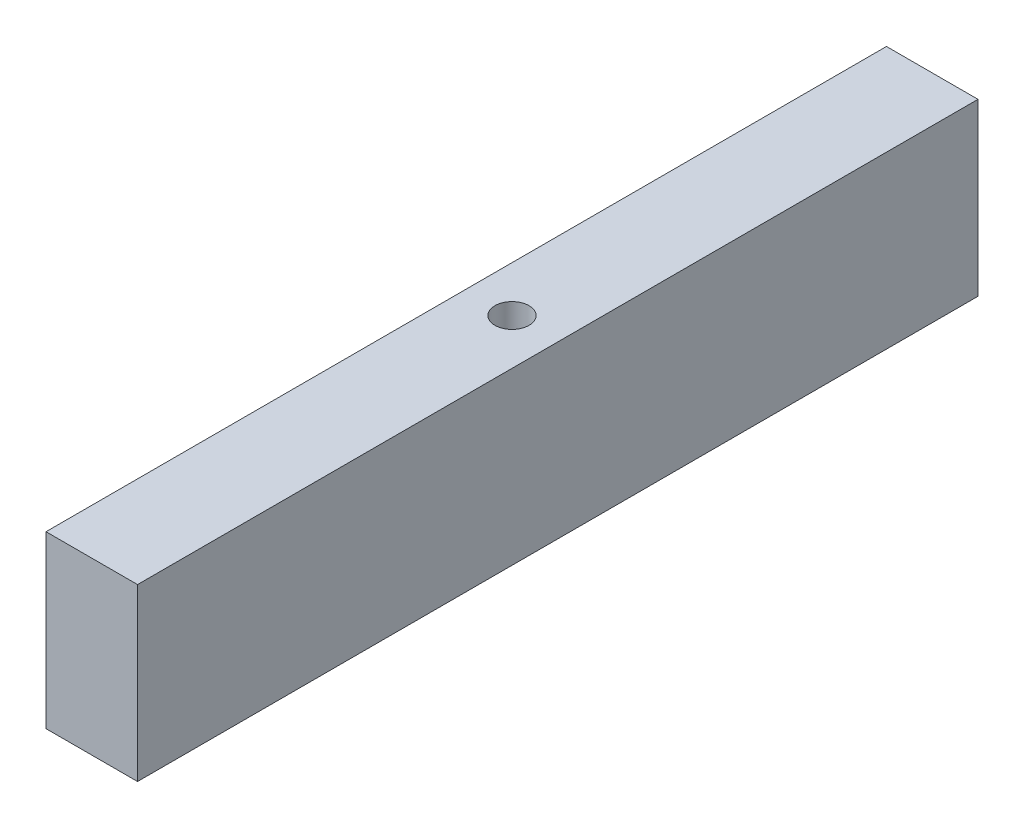
ISO-10303-21;
HEADER;
FILE_DESCRIPTION(('STEP AP214'),'2;1');
FILE_NAME('part.step','',(''),(''),'','','');
FILE_SCHEMA(('AUTOMOTIVE_DESIGN { 1 0 10303 214 1 1 1 1 }'));
ENDSEC;
DATA;
#1=APPLICATION_CONTEXT('core data for automotive mechanical design processes');
#2=APPLICATION_PROTOCOL_DEFINITION('international standard','automotive_design',2000,#1);
#3=PRODUCT_CONTEXT('',#1,'mechanical');
#4=PRODUCT('Part','Part','',(#3));
#5=PRODUCT_RELATED_PRODUCT_CATEGORY('part','',(#4));
#6=PRODUCT_DEFINITION_FORMATION('','',#4);
#7=PRODUCT_DEFINITION_CONTEXT('part definition',#1,'design');
#8=PRODUCT_DEFINITION('design','',#6,#7);
#9=PRODUCT_DEFINITION_SHAPE('','',#8);
#10=(LENGTH_UNIT() NAMED_UNIT(*) SI_UNIT(.MILLI.,.METRE.));
#11=(NAMED_UNIT(*) PLANE_ANGLE_UNIT() SI_UNIT($,.RADIAN.));
#12=(NAMED_UNIT(*) SI_UNIT($,.STERADIAN.) SOLID_ANGLE_UNIT());
#13=UNCERTAINTY_MEASURE_WITH_UNIT(LENGTH_MEASURE(1.E-05),#10,'distance_accuracy_value','');
#14=(GEOMETRIC_REPRESENTATION_CONTEXT(3) GLOBAL_UNCERTAINTY_ASSIGNED_CONTEXT((#13)) GLOBAL_UNIT_ASSIGNED_CONTEXT((#10,
#11,#12)) REPRESENTATION_CONTEXT('',''));
#15=CARTESIAN_POINT('',(0.,0.,0.));
#16=DIRECTION('',(0.,0.,1.));
#17=DIRECTION('',(1.,0.,0.));
#18=AXIS2_PLACEMENT_3D('',#15,#16,#17);
#19=CARTESIAN_POINT('',(-11.,41.,101.));
#20=DIRECTION('',(1.,0.,0.));
#21=DIRECTION('',(0.,0.,-1.));
#22=AXIS2_PLACEMENT_3D('',#19,#20,#21);
#23=PLANE('',#22);
#24=DIRECTION('',(0.,-1.,0.));
#25=VECTOR('',#24,1.);
#26=CARTESIAN_POINT('',(-11.,41.,-101.));
#27=LINE('',#26,#25);
#28=CARTESIAN_POINT('',(-11.,41.,-101.));
#29=VERTEX_POINT('',#28);
#30=CARTESIAN_POINT('',(-11.,0.,-101.));
#31=VERTEX_POINT('',#30);
#32=EDGE_CURVE('E107',#29,#31,#27,.T.);
#33=ORIENTED_EDGE('',*,*,#32,.T.);
#34=DIRECTION('',(0.,0.,-1.));
#35=VECTOR('',#34,1.);
#36=CARTESIAN_POINT('',(-11.,0.,101.));
#37=LINE('',#36,#35);
#38=CARTESIAN_POINT('',(-11.,0.,101.));
#39=VERTEX_POINT('',#38);
#40=EDGE_CURVE('E11',#39,#31,#37,.T.);
#41=ORIENTED_EDGE('',*,*,#40,.F.);
#42=DIRECTION('',(0.,-1.,0.));
#43=VECTOR('',#42,1.);
#44=CARTESIAN_POINT('',(-11.,41.,101.));
#45=LINE('',#44,#43);
#46=CARTESIAN_POINT('',(-11.,41.,101.));
#47=VERTEX_POINT('',#46);
#48=EDGE_CURVE('E92',#47,#39,#45,.T.);
#49=ORIENTED_EDGE('',*,*,#48,.F.);
#50=DIRECTION('',(0.,0.,-1.));
#51=VECTOR('',#50,1.);
#52=CARTESIAN_POINT('',(-11.,41.,101.));
#53=LINE('',#52,#51);
#54=EDGE_CURVE('E102',#47,#29,#53,.T.);
#55=ORIENTED_EDGE('',*,*,#54,.T.);
#56=EDGE_LOOP('',(#33,#41,#49,#55));
#57=FACE_BOUND('',#56,.T.);
#58=ADVANCED_FACE('F43',(#57),#23,.F.);
#59=CARTESIAN_POINT('',(-11.,0.,101.));
#60=DIRECTION('',(0.,1.,0.));
#61=DIRECTION('',(0.,0.,1.));
#62=AXIS2_PLACEMENT_3D('',#59,#60,#61);
#63=PLANE('',#62);
#64=CARTESIAN_POINT('',(0.,0.,0.));
#65=DIRECTION('',(0.,1.,0.));
#66=DIRECTION('',(0.,0.,1.));
#67=AXIS2_PLACEMENT_3D('',#64,#65,#66);
#68=CIRCLE('',#67,4.1);
#69=CARTESIAN_POINT('',(0.,0.,4.1));
#70=VERTEX_POINT('',#69);
#71=EDGE_CURVE('E112',#70,#70,#68,.T.);
#72=ORIENTED_EDGE('',*,*,#71,.T.);
#73=EDGE_LOOP('',(#72));
#74=FACE_BOUND('',#73,.T.);
#75=DIRECTION('',(1.,0.,0.));
#76=VECTOR('',#75,1.);
#77=CARTESIAN_POINT('',(-11.,0.,-101.));
#78=LINE('',#77,#76);
#79=CARTESIAN_POINT('',(11.,0.,-101.));
#80=VERTEX_POINT('',#79);
#81=EDGE_CURVE('E97',#31,#80,#78,.T.);
#82=ORIENTED_EDGE('',*,*,#81,.T.);
#83=DIRECTION('',(0.,0.,-1.));
#84=VECTOR('',#83,1.);
#85=CARTESIAN_POINT('',(11.,0.,101.));
#86=LINE('',#85,#84);
#87=CARTESIAN_POINT('',(11.,0.,101.));
#88=VERTEX_POINT('',#87);
#89=EDGE_CURVE('E55',#88,#80,#86,.T.);
#90=ORIENTED_EDGE('',*,*,#89,.F.);
#91=DIRECTION('',(1.,0.,0.));
#92=VECTOR('',#91,1.);
#93=CARTESIAN_POINT('',(-11.,0.,101.));
#94=LINE('',#93,#92);
#95=EDGE_CURVE('E89',#39,#88,#94,.T.);
#96=ORIENTED_EDGE('',*,*,#95,.F.);
#97=ORIENTED_EDGE('',*,*,#40,.T.);
#98=EDGE_LOOP('',(#82,#90,#96,#97));
#99=FACE_BOUND('',#98,.T.);
#100=ADVANCED_FACE('F98',(#74,#99),#63,.F.);
#101=CARTESIAN_POINT('',(11.,0.,101.));
#102=DIRECTION('',(-1.,0.,0.));
#103=DIRECTION('',(0.,0.,1.));
#104=AXIS2_PLACEMENT_3D('',#101,#102,#103);
#105=PLANE('',#104);
#106=DIRECTION('',(0.,1.,0.));
#107=VECTOR('',#106,1.);
#108=CARTESIAN_POINT('',(11.,0.,-101.));
#109=LINE('',#108,#107);
#110=CARTESIAN_POINT('',(11.,41.,-101.));
#111=VERTEX_POINT('',#110);
#112=EDGE_CURVE('E80',#80,#111,#109,.T.);
#113=ORIENTED_EDGE('',*,*,#112,.T.);
#114=DIRECTION('',(0.,0.,-1.));
#115=VECTOR('',#114,1.);
#116=CARTESIAN_POINT('',(11.,41.,101.));
#117=LINE('',#116,#115);
#118=CARTESIAN_POINT('',(11.,41.,101.));
#119=VERTEX_POINT('',#118);
#120=EDGE_CURVE('E99',#119,#111,#117,.T.);
#121=ORIENTED_EDGE('',*,*,#120,.F.);
#122=DIRECTION('',(0.,1.,0.));
#123=VECTOR('',#122,1.);
#124=CARTESIAN_POINT('',(11.,0.,101.));
#125=LINE('',#124,#123);
#126=EDGE_CURVE('E91',#88,#119,#125,.T.);
#127=ORIENTED_EDGE('',*,*,#126,.F.);
#128=ORIENTED_EDGE('',*,*,#89,.T.);
#129=EDGE_LOOP('',(#113,#121,#127,#128));
#130=FACE_BOUND('',#129,.T.);
#131=ADVANCED_FACE('F105',(#130),#105,.F.);
#132=CARTESIAN_POINT('',(11.,41.,101.));
#133=DIRECTION('',(0.,-1.,0.));
#134=DIRECTION('',(0.,0.,-1.));
#135=AXIS2_PLACEMENT_3D('',#132,#133,#134);
#136=PLANE('',#135);
#137=CARTESIAN_POINT('',(0.,41.,0.));
#138=DIRECTION('',(0.,-1.,0.));
#139=DIRECTION('',(0.,0.,-1.));
#140=AXIS2_PLACEMENT_3D('',#137,#138,#139);
#141=CIRCLE('',#140,4.1);
#142=CARTESIAN_POINT('',(0.,41.,-4.1));
#143=VERTEX_POINT('',#142);
#144=EDGE_CURVE('E46',#143,#143,#141,.T.);
#145=ORIENTED_EDGE('',*,*,#144,.T.);
#146=EDGE_LOOP('',(#145));
#147=FACE_BOUND('',#146,.T.);
#148=DIRECTION('',(-1.,0.,0.));
#149=VECTOR('',#148,1.);
#150=CARTESIAN_POINT('',(11.,41.,-101.));
#151=LINE('',#150,#149);
#152=EDGE_CURVE('E81',#111,#29,#151,.T.);
#153=ORIENTED_EDGE('',*,*,#152,.T.);
#154=ORIENTED_EDGE('',*,*,#54,.F.);
#155=DIRECTION('',(-1.,0.,0.));
#156=VECTOR('',#155,1.);
#157=CARTESIAN_POINT('',(11.,41.,101.));
#158=LINE('',#157,#156);
#159=EDGE_CURVE('E58',#119,#47,#158,.T.);
#160=ORIENTED_EDGE('',*,*,#159,.F.);
#161=ORIENTED_EDGE('',*,*,#120,.T.);
#162=EDGE_LOOP('',(#153,#154,#160,#161));
#163=FACE_BOUND('',#162,.T.);
#164=ADVANCED_FACE('F117',(#147,#163),#136,.F.);
#165=CARTESIAN_POINT('',(0.,0.,101.));
#166=DIRECTION('',(0.,0.,1.));
#167=DIRECTION('',(1.,0.,0.));
#168=AXIS2_PLACEMENT_3D('',#165,#166,#167);
#169=PLANE('',#168);
#170=ORIENTED_EDGE('',*,*,#48,.T.);
#171=ORIENTED_EDGE('',*,*,#95,.T.);
#172=ORIENTED_EDGE('',*,*,#126,.T.);
#173=ORIENTED_EDGE('',*,*,#159,.T.);
#174=EDGE_LOOP('',(#170,#171,#172,#173));
#175=FACE_BOUND('',#174,.T.);
#176=ADVANCED_FACE('F93',(#175),#169,.T.);
#177=CARTESIAN_POINT('',(0.,0.,-101.));
#178=DIRECTION('',(0.,0.,1.));
#179=DIRECTION('',(1.,0.,0.));
#180=AXIS2_PLACEMENT_3D('',#177,#178,#179);
#181=PLANE('',#180);
#182=ORIENTED_EDGE('',*,*,#32,.F.);
#183=ORIENTED_EDGE('',*,*,#152,.F.);
#184=ORIENTED_EDGE('',*,*,#112,.F.);
#185=ORIENTED_EDGE('',*,*,#81,.F.);
#186=EDGE_LOOP('',(#182,#183,#184,#185));
#187=FACE_BOUND('',#186,.T.);
#188=ADVANCED_FACE('F116',(#187),#181,.F.);
#189=CARTESIAN_POINT('',(0.,-46.,0.));
#190=DIRECTION('',(0.,1.,0.));
#191=DIRECTION('',(0.,0.,1.));
#192=AXIS2_PLACEMENT_3D('',#189,#190,#191);
#193=CYLINDRICAL_SURFACE('',#192,4.1);
#194=ORIENTED_EDGE('',*,*,#144,.F.);
#195=EDGE_LOOP('',(#194));
#196=FACE_BOUND('',#195,.T.);
#197=ORIENTED_EDGE('',*,*,#71,.F.);
#198=EDGE_LOOP('',(#197));
#199=FACE_BOUND('',#198,.T.);
#200=ADVANCED_FACE('F129',(#196,#199),#193,.F.);
#201=CLOSED_SHELL('',(#58,#100,#131,#164,#176,#188,#200));
#202=MANIFOLD_SOLID_BREP('B2',#201);
#203=ADVANCED_BREP_SHAPE_REPRESENTATION('',(#18,#202),#14);
#204=SHAPE_DEFINITION_REPRESENTATION(#9,#203);
ENDSEC;
END-ISO-10303-21;
